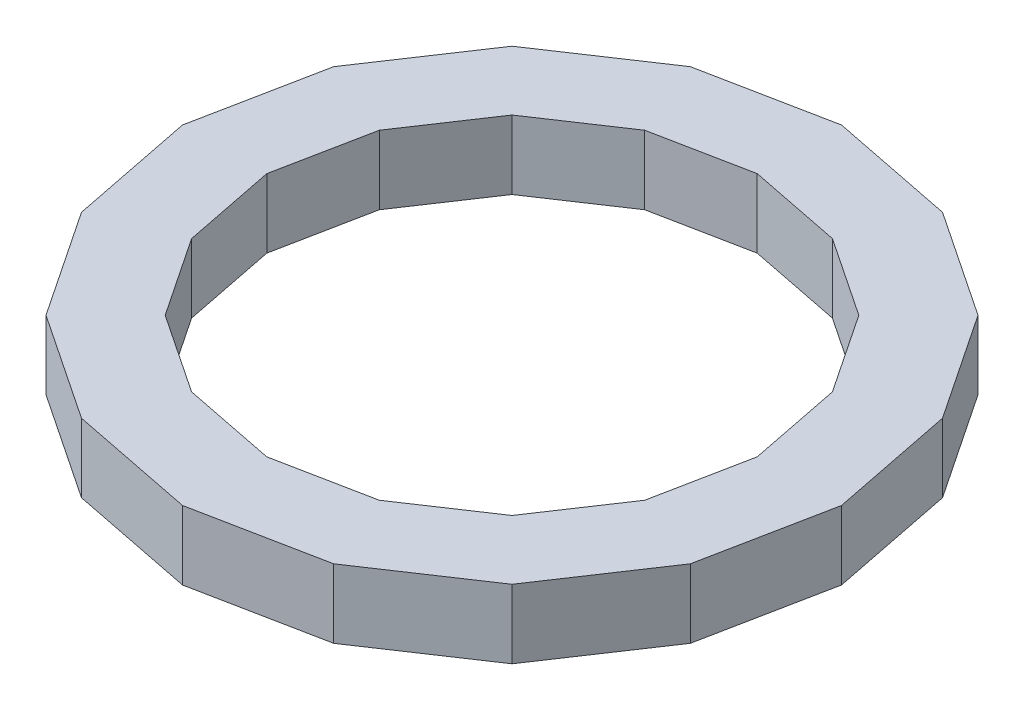
ISO-10303-21;
HEADER;
FILE_DESCRIPTION(('STEP AP214'),'2;1');
FILE_NAME('part.step','',(''),(''),'','','');
FILE_SCHEMA(('AUTOMOTIVE_DESIGN { 1 0 10303 214 1 1 1 1 }'));
ENDSEC;
DATA;
#1=APPLICATION_CONTEXT('core data for automotive mechanical design processes');
#2=APPLICATION_PROTOCOL_DEFINITION('international standard','automotive_design',2000,#1);
#3=PRODUCT_CONTEXT('',#1,'mechanical');
#4=PRODUCT('Part','Part','',(#3));
#5=PRODUCT_RELATED_PRODUCT_CATEGORY('part','',(#4));
#6=PRODUCT_DEFINITION_FORMATION('','',#4);
#7=PRODUCT_DEFINITION_CONTEXT('part definition',#1,'design');
#8=PRODUCT_DEFINITION('design','',#6,#7);
#9=PRODUCT_DEFINITION_SHAPE('','',#8);
#10=(LENGTH_UNIT() NAMED_UNIT(*) SI_UNIT(.MILLI.,.METRE.));
#11=(NAMED_UNIT(*) PLANE_ANGLE_UNIT() SI_UNIT($,.RADIAN.));
#12=(NAMED_UNIT(*) SI_UNIT($,.STERADIAN.) SOLID_ANGLE_UNIT());
#13=UNCERTAINTY_MEASURE_WITH_UNIT(LENGTH_MEASURE(1.E-05),#10,'distance_accuracy_value','');
#14=(GEOMETRIC_REPRESENTATION_CONTEXT(3) GLOBAL_UNCERTAINTY_ASSIGNED_CONTEXT((#13)) GLOBAL_UNIT_ASSIGNED_CONTEXT((#10,
#11,#12)) REPRESENTATION_CONTEXT('',''));
#15=CARTESIAN_POINT('',(0.,0.,0.));
#16=DIRECTION('',(0.,0.,1.));
#17=DIRECTION('',(1.,0.,0.));
#18=AXIS2_PLACEMENT_3D('',#15,#16,#17);
#19=CARTESIAN_POINT('',(0.,19.05,0.));
#20=DIRECTION('',(0.,1.,0.));
#21=DIRECTION('',(0.,0.,1.));
#22=AXIS2_PLACEMENT_3D('',#19,#20,#21);
#23=PLANE('',#22);
#24=DIRECTION('',(0.195090322016117,0.,-0.980785280403233));
#25=VECTOR('',#24,1.);
#26=CARTESIAN_POINT('',(84.1998614707948,19.05,34.8767245711379));
#27=LINE('',#26,#25);
#28=CARTESIAN_POINT('',(84.1998614707948,19.05,34.8767245711379));
#29=VERTEX_POINT('',#28);
#30=CARTESIAN_POINT('',(91.1372733216879,19.05,-1.00961399385723E-12));
#31=VERTEX_POINT('',#30);
#32=EDGE_CURVE('E379',#29,#31,#27,.T.);
#33=ORIENTED_EDGE('',*,*,#32,.T.);
#34=DIRECTION('',(-0.195090322016139,0.,-0.980785280403228));
#35=VECTOR('',#34,1.);
#36=CARTESIAN_POINT('',(91.1372733216879,19.05,-1.00961399385723E-12));
#37=LINE('',#36,#35);
#38=CARTESIAN_POINT('',(84.199861470794,19.05,-34.8767245711398));
#39=VERTEX_POINT('',#38);
#40=EDGE_CURVE('E383',#31,#39,#37,.T.);
#41=ORIENTED_EDGE('',*,*,#40,.T.);
#42=DIRECTION('',(-0.555570233019612,0.,-0.831469612302539));
#43=VECTOR('',#42,1.);
#44=CARTESIAN_POINT('',(84.199861470794,19.05,-34.8767245711398));
#45=LINE('',#44,#43);
#46=CARTESIAN_POINT('',(64.4437839846166,19.05,-64.4437839846181));
#47=VERTEX_POINT('',#46);
#48=EDGE_CURVE('E387',#39,#47,#45,.T.);
#49=ORIENTED_EDGE('',*,*,#48,.T.);
#50=DIRECTION('',(-0.831469612302552,0.,-0.555570233019592));
#51=VECTOR('',#50,1.);
#52=CARTESIAN_POINT('',(64.4437839846166,19.05,-64.4437839846181));
#53=LINE('',#52,#51);
#54=CARTESIAN_POINT('',(34.8767245711379,19.05,-84.1998614707948));
#55=VERTEX_POINT('',#54);
#56=EDGE_CURVE('E390',#47,#55,#53,.T.);
#57=ORIENTED_EDGE('',*,*,#56,.T.);
#58=DIRECTION('',(-0.980785280403233,0.,-0.195090322016117));
#59=VECTOR('',#58,1.);
#60=CARTESIAN_POINT('',(34.8767245711379,19.05,-84.1998614707948));
#61=LINE('',#60,#59);
#62=CARTESIAN_POINT('',(-1.10401997551013E-12,19.05,-91.1372733216879));
#63=VERTEX_POINT('',#62);
#64=EDGE_CURVE('E392',#55,#63,#61,.T.);
#65=ORIENTED_EDGE('',*,*,#64,.T.);
#66=DIRECTION('',(-0.980785280403228,0.,0.195090322016139));
#67=VECTOR('',#66,1.);
#68=CARTESIAN_POINT('',(-1.10401997551013E-12,19.05,-91.1372733216879));
#69=LINE('',#68,#67);
#70=CARTESIAN_POINT('',(-34.8767245711399,19.05,-84.199861470794));
#71=VERTEX_POINT('',#70);
#72=EDGE_CURVE('E395',#63,#71,#69,.T.);
#73=ORIENTED_EDGE('',*,*,#72,.T.);
#74=DIRECTION('',(-0.831469612302539,0.,0.555570233019612));
#75=VECTOR('',#74,1.);
#76=CARTESIAN_POINT('',(-34.8767245711399,19.05,-84.199861470794));
#77=LINE('',#76,#75);
#78=CARTESIAN_POINT('',(-64.4437839846181,19.05,-64.4437839846166));
#79=VERTEX_POINT('',#78);
#80=EDGE_CURVE('E397',#71,#79,#77,.T.);
#81=ORIENTED_EDGE('',*,*,#80,.T.);
#82=DIRECTION('',(-0.555570233019593,0.,0.831469612302552));
#83=VECTOR('',#82,1.);
#84=CARTESIAN_POINT('',(-64.4437839846181,19.05,-64.4437839846166));
#85=LINE('',#84,#83);
#86=CARTESIAN_POINT('',(-84.1998614707948,19.05,-34.8767245711379));
#87=VERTEX_POINT('',#86);
#88=EDGE_CURVE('E399',#79,#87,#85,.T.);
#89=ORIENTED_EDGE('',*,*,#88,.T.);
#90=DIRECTION('',(-0.195090322016117,0.,0.980785280403233));
#91=VECTOR('',#90,1.);
#92=CARTESIAN_POINT('',(-84.1998614707948,19.05,-34.8767245711379));
#93=LINE('',#92,#91);
#94=CARTESIAN_POINT('',(-91.1372733216879,19.05,1.03951490206439E-12));
#95=VERTEX_POINT('',#94);
#96=EDGE_CURVE('E401',#87,#95,#93,.T.);
#97=ORIENTED_EDGE('',*,*,#96,.T.);
#98=DIRECTION('',(0.195090322016139,0.,0.980785280403228));
#99=VECTOR('',#98,1.);
#100=CARTESIAN_POINT('',(-91.1372733216879,19.05,1.03951490206439E-12));
#101=LINE('',#100,#99);
#102=CARTESIAN_POINT('',(-84.199861470794,19.05,34.8767245711399));
#103=VERTEX_POINT('',#102);
#104=EDGE_CURVE('E403',#95,#103,#101,.T.);
#105=ORIENTED_EDGE('',*,*,#104,.T.);
#106=DIRECTION('',(0.555570233019612,0.,0.831469612302539));
#107=VECTOR('',#106,1.);
#108=CARTESIAN_POINT('',(-84.199861470794,19.05,34.8767245711399));
#109=LINE('',#108,#107);
#110=CARTESIAN_POINT('',(-64.4437839846166,19.05,64.4437839846181));
#111=VERTEX_POINT('',#110);
#112=EDGE_CURVE('E405',#103,#111,#109,.T.);
#113=ORIENTED_EDGE('',*,*,#112,.T.);
#114=DIRECTION('',(0.831469612302552,0.,0.555570233019593));
#115=VECTOR('',#114,1.);
#116=CARTESIAN_POINT('',(-64.4437839846166,19.05,64.4437839846181));
#117=LINE('',#116,#115);
#118=CARTESIAN_POINT('',(-34.8767245711379,19.05,84.1998614707948));
#119=VERTEX_POINT('',#118);
#120=EDGE_CURVE('E407',#111,#119,#117,.T.);
#121=ORIENTED_EDGE('',*,*,#120,.T.);
#122=DIRECTION('',(0.980785280403233,0.,0.195090322016117));
#123=VECTOR('',#122,1.);
#124=CARTESIAN_POINT('',(-34.8767245711379,19.05,84.1998614707948));
#125=LINE('',#124,#123);
#126=CARTESIAN_POINT('',(1.00032528467443E-12,19.05,91.137273321688));
#127=VERTEX_POINT('',#126);
#128=EDGE_CURVE('E410',#119,#127,#125,.T.);
#129=ORIENTED_EDGE('',*,*,#128,.T.);
#130=DIRECTION('',(0.980785280403228,0.,-0.195090322016139));
#131=VECTOR('',#130,1.);
#132=CARTESIAN_POINT('',(1.00032528467443E-12,19.05,91.137273321688));
#133=LINE('',#132,#131);
#134=CARTESIAN_POINT('',(34.8767245711398,19.05,84.199861470794));
#135=VERTEX_POINT('',#134);
#136=EDGE_CURVE('E412',#127,#135,#133,.T.);
#137=ORIENTED_EDGE('',*,*,#136,.T.);
#138=DIRECTION('',(0.831469612302539,0.,-0.555570233019611));
#139=VECTOR('',#138,1.);
#140=CARTESIAN_POINT('',(34.8767245711398,19.05,84.199861470794));
#141=LINE('',#140,#139);
#142=CARTESIAN_POINT('',(64.4437839846181,19.05,64.4437839846166));
#143=VERTEX_POINT('',#142);
#144=EDGE_CURVE('E414',#135,#143,#141,.T.);
#145=ORIENTED_EDGE('',*,*,#144,.T.);
#146=DIRECTION('',(0.555570233019593,0.,-0.831469612302552));
#147=VECTOR('',#146,1.);
#148=CARTESIAN_POINT('',(64.4437839846181,19.05,64.4437839846166));
#149=LINE('',#148,#147);
#150=EDGE_CURVE('E416',#143,#29,#149,.T.);
#151=ORIENTED_EDGE('',*,*,#150,.T.);
#152=EDGE_LOOP('',(#33,#41,#49,#57,#65,#73,#81,#89,#97,#105,#113,#121,#129,#137,#145,#151));
#153=FACE_BOUND('',#152,.T.);
#154=DIRECTION('',(-0.19509032201614,0.,-0.980785280403228));
#155=VECTOR('',#154,1.);
#156=CARTESIAN_POINT('',(67.8294194450458,19.05,-7.41912001768866E-13));
#157=LINE('',#156,#155);
#158=CARTESIAN_POINT('',(67.8294194450458,19.05,-7.41912001768866E-13));
#159=VERTEX_POINT('',#158);
#160=CARTESIAN_POINT('',(62.6662123274006,19.05,-25.9571950485622));
#161=VERTEX_POINT('',#160);
#162=EDGE_CURVE('E252',#159,#161,#157,.T.);
#163=ORIENTED_EDGE('',*,*,#162,.F.);
#164=DIRECTION('',(0.195090322016117,0.,-0.980785280403233));
#165=VECTOR('',#164,1.);
#166=CARTESIAN_POINT('',(62.6662123274012,19.05,25.9571950485608));
#167=LINE('',#166,#165);
#168=CARTESIAN_POINT('',(62.6662123274012,19.05,25.9571950485608));
#169=VERTEX_POINT('',#168);
#170=EDGE_CURVE('E243',#169,#159,#167,.T.);
#171=ORIENTED_EDGE('',*,*,#170,.F.);
#172=DIRECTION('',(0.555570233019593,0.,-0.831469612302552));
#173=VECTOR('',#172,1.);
#174=CARTESIAN_POINT('',(47.9626424535391,19.05,47.962642453538));
#175=LINE('',#174,#173);
#176=CARTESIAN_POINT('',(47.9626424535391,19.05,47.962642453538));
#177=VERTEX_POINT('',#176);
#178=EDGE_CURVE('E302',#177,#169,#175,.T.);
#179=ORIENTED_EDGE('',*,*,#178,.F.);
#180=DIRECTION('',(0.831469612302539,0.,-0.555570233019612));
#181=VECTOR('',#180,1.);
#182=CARTESIAN_POINT('',(25.9571950485622,19.05,62.6662123274006));
#183=LINE('',#182,#181);
#184=CARTESIAN_POINT('',(25.9571950485622,19.05,62.6662123274006));
#185=VERTEX_POINT('',#184);
#186=EDGE_CURVE('E300',#185,#177,#183,.T.);
#187=ORIENTED_EDGE('',*,*,#186,.F.);
#188=DIRECTION('',(0.980785280403228,0.,-0.195090322016139));
#189=VECTOR('',#188,1.);
#190=CARTESIAN_POINT('',(8.17724973134349E-13,19.05,67.8294194450458));
#191=LINE('',#190,#189);
#192=CARTESIAN_POINT('',(8.17724973134349E-13,19.05,67.8294194450458));
#193=VERTEX_POINT('',#192);
#194=EDGE_CURVE('E298',#193,#185,#191,.T.);
#195=ORIENTED_EDGE('',*,*,#194,.F.);
#196=DIRECTION('',(0.980785280403233,0.,0.195090322016117));
#197=VECTOR('',#196,1.);
#198=CARTESIAN_POINT('',(-25.9571950485608,19.05,62.6662123274012));
#199=LINE('',#198,#197);
#200=CARTESIAN_POINT('',(-25.9571950485608,19.05,62.6662123274012));
#201=VERTEX_POINT('',#200);
#202=EDGE_CURVE('E296',#201,#193,#199,.T.);
#203=ORIENTED_EDGE('',*,*,#202,.F.);
#204=DIRECTION('',(0.831469612302552,0.,0.555570233019593));
#205=VECTOR('',#204,1.);
#206=CARTESIAN_POINT('',(-47.962642453538,19.05,47.9626424535391));
#207=LINE('',#206,#205);
#208=CARTESIAN_POINT('',(-47.962642453538,19.05,47.9626424535391));
#209=VERTEX_POINT('',#208);
#210=EDGE_CURVE('E294',#209,#201,#207,.T.);
#211=ORIENTED_EDGE('',*,*,#210,.F.);
#212=DIRECTION('',(0.555570233019612,0.,0.831469612302539));
#213=VECTOR('',#212,1.);
#214=CARTESIAN_POINT('',(-62.6662123274006,19.05,25.9571950485623));
#215=LINE('',#214,#213);
#216=CARTESIAN_POINT('',(-62.6662123274006,19.05,25.9571950485623));
#217=VERTEX_POINT('',#216);
#218=EDGE_CURVE('E291',#217,#209,#215,.T.);
#219=ORIENTED_EDGE('',*,*,#218,.F.);
#220=DIRECTION('',(0.19509032201614,0.,0.980785280403228));
#221=VECTOR('',#220,1.);
#222=CARTESIAN_POINT('',(-67.8294194450458,19.05,7.76293029344912E-13));
#223=LINE('',#222,#221);
#224=CARTESIAN_POINT('',(-67.8294194450458,19.05,7.76293029344912E-13));
#225=VERTEX_POINT('',#224);
#226=EDGE_CURVE('E289',#225,#217,#223,.T.);
#227=ORIENTED_EDGE('',*,*,#226,.F.);
#228=DIRECTION('',(-0.195090322016117,0.,0.980785280403233));
#229=VECTOR('',#228,1.);
#230=CARTESIAN_POINT('',(-62.6662123274012,19.05,-25.9571950485608));
#231=LINE('',#230,#229);
#232=CARTESIAN_POINT('',(-62.6662123274012,19.05,-25.9571950485608));
#233=VERTEX_POINT('',#232);
#234=EDGE_CURVE('E286',#233,#225,#231,.T.);
#235=ORIENTED_EDGE('',*,*,#234,.F.);
#236=DIRECTION('',(-0.555570233019592,0.,0.831469612302552));
#237=VECTOR('',#236,1.);
#238=CARTESIAN_POINT('',(-47.9626424535391,19.05,-47.962642453538));
#239=LINE('',#238,#237);
#240=CARTESIAN_POINT('',(-47.9626424535391,19.05,-47.962642453538));
#241=VERTEX_POINT('',#240);
#242=EDGE_CURVE('E284',#241,#233,#239,.T.);
#243=ORIENTED_EDGE('',*,*,#242,.F.);
#244=DIRECTION('',(-0.831469612302539,0.,0.555570233019612));
#245=VECTOR('',#244,1.);
#246=CARTESIAN_POINT('',(-25.9571950485623,19.05,-62.6662123274006));
#247=LINE('',#246,#245);
#248=CARTESIAN_POINT('',(-25.9571950485623,19.05,-62.6662123274006));
#249=VERTEX_POINT('',#248);
#250=EDGE_CURVE('E281',#249,#241,#247,.T.);
#251=ORIENTED_EDGE('',*,*,#250,.F.);
#252=DIRECTION('',(-0.980785280403228,0.,0.19509032201614));
#253=VECTOR('',#252,1.);
#254=CARTESIAN_POINT('',(-7.98168190524189E-13,19.05,-67.8294194450458));
#255=LINE('',#254,#253);
#256=CARTESIAN_POINT('',(-7.98168190524189E-13,19.05,-67.8294194450458));
#257=VERTEX_POINT('',#256);
#258=EDGE_CURVE('E279',#257,#249,#255,.T.);
#259=ORIENTED_EDGE('',*,*,#258,.F.);
#260=DIRECTION('',(-0.980785280403233,0.,-0.195090322016117));
#261=VECTOR('',#260,1.);
#262=CARTESIAN_POINT('',(25.9571950485607,19.05,-62.6662123274012));
#263=LINE('',#262,#261);
#264=CARTESIAN_POINT('',(25.9571950485607,19.05,-62.6662123274012));
#265=VERTEX_POINT('',#264);
#266=EDGE_CURVE('E277',#265,#257,#263,.T.);
#267=ORIENTED_EDGE('',*,*,#266,.F.);
#268=DIRECTION('',(-0.831469612302552,0.,-0.555570233019593));
#269=VECTOR('',#268,1.);
#270=CARTESIAN_POINT('',(47.962642453538,19.05,-47.9626424535391));
#271=LINE('',#270,#269);
#272=CARTESIAN_POINT('',(47.962642453538,19.05,-47.9626424535391));
#273=VERTEX_POINT('',#272);
#274=EDGE_CURVE('E272',#273,#265,#271,.T.);
#275=ORIENTED_EDGE('',*,*,#274,.F.);
#276=DIRECTION('',(-0.555570233019612,0.,-0.831469612302539));
#277=VECTOR('',#276,1.);
#278=CARTESIAN_POINT('',(62.6662123274006,19.05,-25.9571950485622));
#279=LINE('',#278,#277);
#280=EDGE_CURVE('E265',#161,#273,#279,.T.);
#281=ORIENTED_EDGE('',*,*,#280,.F.);
#282=EDGE_LOOP('',(#163,#171,#179,#187,#195,#203,#211,#219,#227,#235,#243,#251,#259,#267,#275,#281));
#283=FACE_BOUND('',#282,.T.);
#284=ADVANCED_FACE('F34',(#153,#283),#23,.T.);
#285=CARTESIAN_POINT('',(0.,0.,0.));
#286=DIRECTION('',(0.,1.,0.));
#287=DIRECTION('',(0.,0.,1.));
#288=AXIS2_PLACEMENT_3D('',#285,#286,#287);
#289=PLANE('',#288);
#290=DIRECTION('',(0.195090322016117,0.,-0.980785280403233));
#291=VECTOR('',#290,1.);
#292=CARTESIAN_POINT('',(84.1998614707948,0.,34.8767245711379));
#293=LINE('',#292,#291);
#294=CARTESIAN_POINT('',(84.1998614707948,0.,34.8767245711379));
#295=VERTEX_POINT('',#294);
#296=CARTESIAN_POINT('',(91.1372733216879,0.,-1.00961399385723E-12));
#297=VERTEX_POINT('',#296);
#298=EDGE_CURVE('E260',#295,#297,#293,.T.);
#299=ORIENTED_EDGE('',*,*,#298,.F.);
#300=DIRECTION('',(0.555570233019593,0.,-0.831469612302552));
#301=VECTOR('',#300,1.);
#302=CARTESIAN_POINT('',(64.4437839846181,0.,64.4437839846166));
#303=LINE('',#302,#301);
#304=CARTESIAN_POINT('',(64.4437839846181,0.,64.4437839846166));
#305=VERTEX_POINT('',#304);
#306=EDGE_CURVE('E384',#305,#295,#303,.T.);
#307=ORIENTED_EDGE('',*,*,#306,.F.);
#308=DIRECTION('',(0.831469612302539,0.,-0.555570233019611));
#309=VECTOR('',#308,1.);
#310=CARTESIAN_POINT('',(34.8767245711398,0.,84.199861470794));
#311=LINE('',#310,#309);
#312=CARTESIAN_POINT('',(34.8767245711398,0.,84.199861470794));
#313=VERTEX_POINT('',#312);
#314=EDGE_CURVE('E450',#313,#305,#311,.T.);
#315=ORIENTED_EDGE('',*,*,#314,.F.);
#316=DIRECTION('',(0.980785280403228,0.,-0.195090322016139));
#317=VECTOR('',#316,1.);
#318=CARTESIAN_POINT('',(1.00032528467443E-12,0.,91.137273321688));
#319=LINE('',#318,#317);
#320=CARTESIAN_POINT('',(1.00032528467443E-12,0.,91.137273321688));
#321=VERTEX_POINT('',#320);
#322=EDGE_CURVE('E448',#321,#313,#319,.T.);
#323=ORIENTED_EDGE('',*,*,#322,.F.);
#324=DIRECTION('',(0.980785280403233,0.,0.195090322016117));
#325=VECTOR('',#324,1.);
#326=CARTESIAN_POINT('',(-34.8767245711379,0.,84.1998614707948));
#327=LINE('',#326,#325);
#328=CARTESIAN_POINT('',(-34.8767245711379,0.,84.1998614707948));
#329=VERTEX_POINT('',#328);
#330=EDGE_CURVE('E445',#329,#321,#327,.T.);
#331=ORIENTED_EDGE('',*,*,#330,.F.);
#332=DIRECTION('',(0.831469612302552,0.,0.555570233019593));
#333=VECTOR('',#332,1.);
#334=CARTESIAN_POINT('',(-64.4437839846166,0.,64.4437839846181));
#335=LINE('',#334,#333);
#336=CARTESIAN_POINT('',(-64.4437839846166,0.,64.4437839846181));
#337=VERTEX_POINT('',#336);
#338=EDGE_CURVE('E443',#337,#329,#335,.T.);
#339=ORIENTED_EDGE('',*,*,#338,.F.);
#340=DIRECTION('',(0.555570233019612,0.,0.831469612302539));
#341=VECTOR('',#340,1.);
#342=CARTESIAN_POINT('',(-84.199861470794,0.,34.8767245711399));
#343=LINE('',#342,#341);
#344=CARTESIAN_POINT('',(-84.199861470794,0.,34.8767245711399));
#345=VERTEX_POINT('',#344);
#346=EDGE_CURVE('E441',#345,#337,#343,.T.);
#347=ORIENTED_EDGE('',*,*,#346,.F.);
#348=DIRECTION('',(0.195090322016139,0.,0.980785280403228));
#349=VECTOR('',#348,1.);
#350=CARTESIAN_POINT('',(-91.1372733216879,0.,1.03951490206439E-12));
#351=LINE('',#350,#349);
#352=CARTESIAN_POINT('',(-91.1372733216879,0.,1.03951490206439E-12));
#353=VERTEX_POINT('',#352);
#354=EDGE_CURVE('E439',#353,#345,#351,.T.);
#355=ORIENTED_EDGE('',*,*,#354,.F.);
#356=DIRECTION('',(-0.195090322016117,0.,0.980785280403233));
#357=VECTOR('',#356,1.);
#358=CARTESIAN_POINT('',(-84.1998614707948,0.,-34.8767245711379));
#359=LINE('',#358,#357);
#360=CARTESIAN_POINT('',(-84.1998614707948,0.,-34.8767245711379));
#361=VERTEX_POINT('',#360);
#362=EDGE_CURVE('E437',#361,#353,#359,.T.);
#363=ORIENTED_EDGE('',*,*,#362,.F.);
#364=DIRECTION('',(-0.555570233019593,0.,0.831469612302552));
#365=VECTOR('',#364,1.);
#366=CARTESIAN_POINT('',(-64.4437839846181,0.,-64.4437839846166));
#367=LINE('',#366,#365);
#368=CARTESIAN_POINT('',(-64.4437839846181,0.,-64.4437839846166));
#369=VERTEX_POINT('',#368);
#370=EDGE_CURVE('E435',#369,#361,#367,.T.);
#371=ORIENTED_EDGE('',*,*,#370,.F.);
#372=DIRECTION('',(-0.831469612302539,0.,0.555570233019612));
#373=VECTOR('',#372,1.);
#374=CARTESIAN_POINT('',(-34.8767245711399,0.,-84.199861470794));
#375=LINE('',#374,#373);
#376=CARTESIAN_POINT('',(-34.8767245711399,0.,-84.199861470794));
#377=VERTEX_POINT('',#376);
#378=EDGE_CURVE('E433',#377,#369,#375,.T.);
#379=ORIENTED_EDGE('',*,*,#378,.F.);
#380=DIRECTION('',(-0.980785280403228,0.,0.195090322016139));
#381=VECTOR('',#380,1.);
#382=CARTESIAN_POINT('',(-1.10401997551013E-12,0.,-91.1372733216879));
#383=LINE('',#382,#381);
#384=CARTESIAN_POINT('',(-1.10401997551013E-12,0.,-91.1372733216879));
#385=VERTEX_POINT('',#384);
#386=EDGE_CURVE('E431',#385,#377,#383,.T.);
#387=ORIENTED_EDGE('',*,*,#386,.F.);
#388=DIRECTION('',(-0.980785280403233,0.,-0.195090322016117));
#389=VECTOR('',#388,1.);
#390=CARTESIAN_POINT('',(34.8767245711379,0.,-84.1998614707948));
#391=LINE('',#390,#389);
#392=CARTESIAN_POINT('',(34.8767245711379,0.,-84.1998614707948));
#393=VERTEX_POINT('',#392);
#394=EDGE_CURVE('E429',#393,#385,#391,.T.);
#395=ORIENTED_EDGE('',*,*,#394,.F.);
#396=DIRECTION('',(-0.831469612302552,0.,-0.555570233019592));
#397=VECTOR('',#396,1.);
#398=CARTESIAN_POINT('',(64.4437839846166,0.,-64.4437839846181));
#399=LINE('',#398,#397);
#400=CARTESIAN_POINT('',(64.4437839846166,0.,-64.4437839846181));
#401=VERTEX_POINT('',#400);
#402=EDGE_CURVE('E427',#401,#393,#399,.T.);
#403=ORIENTED_EDGE('',*,*,#402,.F.);
#404=DIRECTION('',(-0.555570233019612,0.,-0.831469612302539));
#405=VECTOR('',#404,1.);
#406=CARTESIAN_POINT('',(84.199861470794,0.,-34.8767245711398));
#407=LINE('',#406,#405);
#408=CARTESIAN_POINT('',(84.199861470794,0.,-34.8767245711398));
#409=VERTEX_POINT('',#408);
#410=EDGE_CURVE('E424',#409,#401,#407,.T.);
#411=ORIENTED_EDGE('',*,*,#410,.F.);
#412=DIRECTION('',(-0.195090322016139,0.,-0.980785280403228));
#413=VECTOR('',#412,1.);
#414=CARTESIAN_POINT('',(91.1372733216879,0.,-1.00961399385723E-12));
#415=LINE('',#414,#413);
#416=EDGE_CURVE('E421',#297,#409,#415,.T.);
#417=ORIENTED_EDGE('',*,*,#416,.F.);
#418=EDGE_LOOP('',(#299,#307,#315,#323,#331,#339,#347,#355,#363,#371,#379,#387,#395,#403,#411,#417));
#419=FACE_BOUND('',#418,.T.);
#420=DIRECTION('',(0.195090322016117,0.,-0.980785280403233));
#421=VECTOR('',#420,1.);
#422=CARTESIAN_POINT('',(62.6662123274012,0.,25.9571950485608));
#423=LINE('',#422,#421);
#424=CARTESIAN_POINT('',(62.6662123274012,0.,25.9571950485608));
#425=VERTEX_POINT('',#424);
#426=CARTESIAN_POINT('',(67.8294194450458,0.,-7.41912001768866E-13));
#427=VERTEX_POINT('',#426);
#428=EDGE_CURVE('E57',#425,#427,#423,.T.);
#429=ORIENTED_EDGE('',*,*,#428,.T.);
#430=DIRECTION('',(-0.19509032201614,0.,-0.980785280403228));
#431=VECTOR('',#430,1.);
#432=CARTESIAN_POINT('',(67.8294194450458,0.,-7.41912001768866E-13));
#433=LINE('',#432,#431);
#434=CARTESIAN_POINT('',(62.6662123274006,0.,-25.9571950485622));
#435=VERTEX_POINT('',#434);
#436=EDGE_CURVE('E259',#427,#435,#433,.T.);
#437=ORIENTED_EDGE('',*,*,#436,.T.);
#438=DIRECTION('',(-0.555570233019612,0.,-0.831469612302539));
#439=VECTOR('',#438,1.);
#440=CARTESIAN_POINT('',(62.6662123274006,0.,-25.9571950485622));
#441=LINE('',#440,#439);
#442=CARTESIAN_POINT('',(47.962642453538,0.,-47.9626424535391));
#443=VERTEX_POINT('',#442);
#444=EDGE_CURVE('E308',#435,#443,#441,.T.);
#445=ORIENTED_EDGE('',*,*,#444,.T.);
#446=DIRECTION('',(-0.831469612302552,0.,-0.555570233019593));
#447=VECTOR('',#446,1.);
#448=CARTESIAN_POINT('',(47.962642453538,0.,-47.9626424535391));
#449=LINE('',#448,#447);
#450=CARTESIAN_POINT('',(25.9571950485607,0.,-62.6662123274012));
#451=VERTEX_POINT('',#450);
#452=EDGE_CURVE('E311',#443,#451,#449,.T.);
#453=ORIENTED_EDGE('',*,*,#452,.T.);
#454=DIRECTION('',(-0.980785280403233,0.,-0.195090322016117));
#455=VECTOR('',#454,1.);
#456=CARTESIAN_POINT('',(25.9571950485607,0.,-62.6662123274012));
#457=LINE('',#456,#455);
#458=CARTESIAN_POINT('',(-7.98168190524189E-13,0.,-67.8294194450458));
#459=VERTEX_POINT('',#458);
#460=EDGE_CURVE('E314',#451,#459,#457,.T.);
#461=ORIENTED_EDGE('',*,*,#460,.T.);
#462=DIRECTION('',(-0.980785280403228,0.,0.19509032201614));
#463=VECTOR('',#462,1.);
#464=CARTESIAN_POINT('',(-7.98168190524189E-13,0.,-67.8294194450458));
#465=LINE('',#464,#463);
#466=CARTESIAN_POINT('',(-25.9571950485623,0.,-62.6662123274006));
#467=VERTEX_POINT('',#466);
#468=EDGE_CURVE('E318',#459,#467,#465,.T.);
#469=ORIENTED_EDGE('',*,*,#468,.T.);
#470=DIRECTION('',(-0.831469612302539,0.,0.555570233019612));
#471=VECTOR('',#470,1.);
#472=CARTESIAN_POINT('',(-25.9571950485623,0.,-62.6662123274006));
#473=LINE('',#472,#471);
#474=CARTESIAN_POINT('',(-47.9626424535391,0.,-47.962642453538));
#475=VERTEX_POINT('',#474);
#476=EDGE_CURVE('E322',#467,#475,#473,.T.);
#477=ORIENTED_EDGE('',*,*,#476,.T.);
#478=DIRECTION('',(-0.555570233019592,0.,0.831469612302552));
#479=VECTOR('',#478,1.);
#480=CARTESIAN_POINT('',(-47.9626424535391,0.,-47.962642453538));
#481=LINE('',#480,#479);
#482=CARTESIAN_POINT('',(-62.6662123274012,0.,-25.9571950485608));
#483=VERTEX_POINT('',#482);
#484=EDGE_CURVE('E326',#475,#483,#481,.T.);
#485=ORIENTED_EDGE('',*,*,#484,.T.);
#486=DIRECTION('',(-0.195090322016117,0.,0.980785280403233));
#487=VECTOR('',#486,1.);
#488=CARTESIAN_POINT('',(-62.6662123274012,0.,-25.9571950485608));
#489=LINE('',#488,#487);
#490=CARTESIAN_POINT('',(-67.8294194450458,0.,7.76293029344912E-13));
#491=VERTEX_POINT('',#490);
#492=EDGE_CURVE('E329',#483,#491,#489,.T.);
#493=ORIENTED_EDGE('',*,*,#492,.T.);
#494=DIRECTION('',(0.19509032201614,0.,0.980785280403228));
#495=VECTOR('',#494,1.);
#496=CARTESIAN_POINT('',(-67.8294194450458,0.,7.76293029344912E-13));
#497=LINE('',#496,#495);
#498=CARTESIAN_POINT('',(-62.6662123274006,0.,25.9571950485623));
#499=VERTEX_POINT('',#498);
#500=EDGE_CURVE('E332',#491,#499,#497,.T.);
#501=ORIENTED_EDGE('',*,*,#500,.T.);
#502=DIRECTION('',(0.555570233019612,0.,0.831469612302539));
#503=VECTOR('',#502,1.);
#504=CARTESIAN_POINT('',(-62.6662123274006,0.,25.9571950485623));
#505=LINE('',#504,#503);
#506=CARTESIAN_POINT('',(-47.962642453538,0.,47.9626424535391));
#507=VERTEX_POINT('',#506);
#508=EDGE_CURVE('E335',#499,#507,#505,.T.);
#509=ORIENTED_EDGE('',*,*,#508,.T.);
#510=DIRECTION('',(0.831469612302552,0.,0.555570233019593));
#511=VECTOR('',#510,1.);
#512=CARTESIAN_POINT('',(-47.962642453538,0.,47.9626424535391));
#513=LINE('',#512,#511);
#514=CARTESIAN_POINT('',(-25.9571950485608,0.,62.6662123274012));
#515=VERTEX_POINT('',#514);
#516=EDGE_CURVE('E338',#507,#515,#513,.T.);
#517=ORIENTED_EDGE('',*,*,#516,.T.);
#518=DIRECTION('',(0.980785280403233,0.,0.195090322016117));
#519=VECTOR('',#518,1.);
#520=CARTESIAN_POINT('',(-25.9571950485608,0.,62.6662123274012));
#521=LINE('',#520,#519);
#522=CARTESIAN_POINT('',(8.17724973134349E-13,0.,67.8294194450458));
#523=VERTEX_POINT('',#522);
#524=EDGE_CURVE('E341',#515,#523,#521,.T.);
#525=ORIENTED_EDGE('',*,*,#524,.T.);
#526=DIRECTION('',(0.980785280403228,0.,-0.195090322016139));
#527=VECTOR('',#526,1.);
#528=CARTESIAN_POINT('',(8.17724973134349E-13,0.,67.8294194450458));
#529=LINE('',#528,#527);
#530=CARTESIAN_POINT('',(25.9571950485622,0.,62.6662123274006));
#531=VERTEX_POINT('',#530);
#532=EDGE_CURVE('E344',#523,#531,#529,.T.);
#533=ORIENTED_EDGE('',*,*,#532,.T.);
#534=DIRECTION('',(0.831469612302539,0.,-0.555570233019612));
#535=VECTOR('',#534,1.);
#536=CARTESIAN_POINT('',(25.9571950485622,0.,62.6662123274006));
#537=LINE('',#536,#535);
#538=CARTESIAN_POINT('',(47.9626424535391,0.,47.962642453538));
#539=VERTEX_POINT('',#538);
#540=EDGE_CURVE('E347',#531,#539,#537,.T.);
#541=ORIENTED_EDGE('',*,*,#540,.T.);
#542=DIRECTION('',(0.555570233019593,0.,-0.831469612302552));
#543=VECTOR('',#542,1.);
#544=CARTESIAN_POINT('',(47.9626424535391,0.,47.962642453538));
#545=LINE('',#544,#543);
#546=EDGE_CURVE('E253',#539,#425,#545,.T.);
#547=ORIENTED_EDGE('',*,*,#546,.T.);
#548=EDGE_LOOP('',(#429,#437,#445,#453,#461,#469,#477,#485,#493,#501,#509,#517,#525,#533,#541,#547));
#549=FACE_BOUND('',#548,.T.);
#550=ADVANCED_FACE('F510',(#419,#549),#289,.F.);
#551=CARTESIAN_POINT('',(84.1998614707948,19.05,34.8767245711379));
#552=DIRECTION('',(-0.980785280403233,0.,-0.195090322016117));
#553=DIRECTION('',(-0.195090322016118,0.,0.980785280403233));
#554=AXIS2_PLACEMENT_3D('',#551,#552,#553);
#555=PLANE('',#554);
#556=ORIENTED_EDGE('',*,*,#298,.T.);
#557=DIRECTION('',(0.,-1.,0.));
#558=VECTOR('',#557,1.);
#559=CARTESIAN_POINT('',(91.1372733216879,19.05,-1.00961399385723E-12));
#560=LINE('',#559,#558);
#561=EDGE_CURVE('E11',#31,#297,#560,.T.);
#562=ORIENTED_EDGE('',*,*,#561,.F.);
#563=ORIENTED_EDGE('',*,*,#32,.F.);
#564=DIRECTION('',(0.,-1.,0.));
#565=VECTOR('',#564,1.);
#566=CARTESIAN_POINT('',(84.1998614707948,19.05,34.8767245711379));
#567=LINE('',#566,#565);
#568=EDGE_CURVE('E418',#29,#295,#567,.T.);
#569=ORIENTED_EDGE('',*,*,#568,.T.);
#570=EDGE_LOOP('',(#556,#562,#563,#569));
#571=FACE_BOUND('',#570,.T.);
#572=ADVANCED_FACE('F36',(#571),#555,.F.);
#573=CARTESIAN_POINT('',(91.1372733216879,19.05,-1.00961399385723E-12));
#574=DIRECTION('',(-0.980785280403228,0.,0.195090322016139));
#575=DIRECTION('',(0.195090322016139,0.,0.980785280403228));
#576=AXIS2_PLACEMENT_3D('',#573,#574,#575);
#577=PLANE('',#576);
#578=ORIENTED_EDGE('',*,*,#416,.T.);
#579=DIRECTION('',(0.,-1.,0.));
#580=VECTOR('',#579,1.);
#581=CARTESIAN_POINT('',(84.199861470794,19.05,-34.8767245711398));
#582=LINE('',#581,#580);
#583=EDGE_CURVE('E42',#39,#409,#582,.T.);
#584=ORIENTED_EDGE('',*,*,#583,.F.);
#585=ORIENTED_EDGE('',*,*,#40,.F.);
#586=ORIENTED_EDGE('',*,*,#561,.T.);
#587=EDGE_LOOP('',(#578,#584,#585,#586));
#588=FACE_BOUND('',#587,.T.);
#589=ADVANCED_FACE('F527',(#588),#577,.F.);
#590=CARTESIAN_POINT('',(84.199861470794,19.05,-34.8767245711398));
#591=DIRECTION('',(-0.831469612302539,0.,0.555570233019612));
#592=DIRECTION('',(0.555570233019612,0.,0.831469612302539));
#593=AXIS2_PLACEMENT_3D('',#590,#591,#592);
#594=PLANE('',#593);
#595=ORIENTED_EDGE('',*,*,#410,.T.);
#596=DIRECTION('',(0.,-1.,0.));
#597=VECTOR('',#596,1.);
#598=CARTESIAN_POINT('',(64.4437839846166,19.05,-64.4437839846181));
#599=LINE('',#598,#597);
#600=EDGE_CURVE('E495',#47,#401,#599,.T.);
#601=ORIENTED_EDGE('',*,*,#600,.F.);
#602=ORIENTED_EDGE('',*,*,#48,.F.);
#603=ORIENTED_EDGE('',*,*,#583,.T.);
#604=EDGE_LOOP('',(#595,#601,#602,#603));
#605=FACE_BOUND('',#604,.T.);
#606=ADVANCED_FACE('F504',(#605),#594,.F.);
#607=CARTESIAN_POINT('',(64.4437839846166,19.05,-64.4437839846181));
#608=DIRECTION('',(-0.555570233019592,0.,0.831469612302552));
#609=DIRECTION('',(0.831469612302552,0.,0.555570233019592));
#610=AXIS2_PLACEMENT_3D('',#607,#608,#609);
#611=PLANE('',#610);
#612=ORIENTED_EDGE('',*,*,#402,.T.);
#613=DIRECTION('',(0.,-1.,0.));
#614=VECTOR('',#613,1.);
#615=CARTESIAN_POINT('',(34.8767245711379,19.05,-84.1998614707948));
#616=LINE('',#615,#614);
#617=EDGE_CURVE('E492',#55,#393,#616,.T.);
#618=ORIENTED_EDGE('',*,*,#617,.F.);
#619=ORIENTED_EDGE('',*,*,#56,.F.);
#620=ORIENTED_EDGE('',*,*,#600,.T.);
#621=EDGE_LOOP('',(#612,#618,#619,#620));
#622=FACE_BOUND('',#621,.T.);
#623=ADVANCED_FACE('F516',(#622),#611,.F.);
#624=CARTESIAN_POINT('',(34.8767245711379,19.05,-84.1998614707948));
#625=DIRECTION('',(-0.195090322016117,0.,0.980785280403233));
#626=DIRECTION('',(0.980785280403233,0.,0.195090322016117));
#627=AXIS2_PLACEMENT_3D('',#624,#625,#626);
#628=PLANE('',#627);
#629=ORIENTED_EDGE('',*,*,#394,.T.);
#630=DIRECTION('',(0.,-1.,0.));
#631=VECTOR('',#630,1.);
#632=CARTESIAN_POINT('',(-1.10401997551013E-12,19.05,-91.1372733216879));
#633=LINE('',#632,#631);
#634=EDGE_CURVE('E489',#63,#385,#633,.T.);
#635=ORIENTED_EDGE('',*,*,#634,.F.);
#636=ORIENTED_EDGE('',*,*,#64,.F.);
#637=ORIENTED_EDGE('',*,*,#617,.T.);
#638=EDGE_LOOP('',(#629,#635,#636,#637));
#639=FACE_BOUND('',#638,.T.);
#640=ADVANCED_FACE('F520',(#639),#628,.F.);
#641=CARTESIAN_POINT('',(-1.10401997551013E-12,19.05,-91.1372733216879));
#642=DIRECTION('',(0.195090322016139,0.,0.980785280403228));
#643=DIRECTION('',(0.980785280403228,0.,-0.195090322016139));
#644=AXIS2_PLACEMENT_3D('',#641,#642,#643);
#645=PLANE('',#644);
#646=ORIENTED_EDGE('',*,*,#386,.T.);
#647=DIRECTION('',(0.,-1.,0.));
#648=VECTOR('',#647,1.);
#649=CARTESIAN_POINT('',(-34.8767245711399,19.05,-84.199861470794));
#650=LINE('',#649,#648);
#651=EDGE_CURVE('E486',#71,#377,#650,.T.);
#652=ORIENTED_EDGE('',*,*,#651,.F.);
#653=ORIENTED_EDGE('',*,*,#72,.F.);
#654=ORIENTED_EDGE('',*,*,#634,.T.);
#655=EDGE_LOOP('',(#646,#652,#653,#654));
#656=FACE_BOUND('',#655,.T.);
#657=ADVANCED_FACE('F580',(#656),#645,.F.);
#658=CARTESIAN_POINT('',(-34.8767245711399,19.05,-84.199861470794));
#659=DIRECTION('',(0.555570233019612,0.,0.831469612302539));
#660=DIRECTION('',(0.831469612302539,0.,-0.555570233019612));
#661=AXIS2_PLACEMENT_3D('',#658,#659,#660);
#662=PLANE('',#661);
#663=ORIENTED_EDGE('',*,*,#378,.T.);
#664=DIRECTION('',(0.,-1.,0.));
#665=VECTOR('',#664,1.);
#666=CARTESIAN_POINT('',(-64.4437839846181,19.05,-64.4437839846166));
#667=LINE('',#666,#665);
#668=EDGE_CURVE('E482',#79,#369,#667,.T.);
#669=ORIENTED_EDGE('',*,*,#668,.F.);
#670=ORIENTED_EDGE('',*,*,#80,.F.);
#671=ORIENTED_EDGE('',*,*,#651,.T.);
#672=EDGE_LOOP('',(#663,#669,#670,#671));
#673=FACE_BOUND('',#672,.T.);
#674=ADVANCED_FACE('F577',(#673),#662,.F.);
#675=CARTESIAN_POINT('',(-64.4437839846181,19.05,-64.4437839846166));
#676=DIRECTION('',(0.831469612302552,0.,0.555570233019592));
#677=DIRECTION('',(0.555570233019593,0.,-0.831469612302552));
#678=AXIS2_PLACEMENT_3D('',#675,#676,#677);
#679=PLANE('',#678);
#680=ORIENTED_EDGE('',*,*,#370,.T.);
#681=DIRECTION('',(0.,-1.,0.));
#682=VECTOR('',#681,1.);
#683=CARTESIAN_POINT('',(-84.1998614707948,19.05,-34.8767245711379));
#684=LINE('',#683,#682);
#685=EDGE_CURVE('E479',#87,#361,#684,.T.);
#686=ORIENTED_EDGE('',*,*,#685,.F.);
#687=ORIENTED_EDGE('',*,*,#88,.F.);
#688=ORIENTED_EDGE('',*,*,#668,.T.);
#689=EDGE_LOOP('',(#680,#686,#687,#688));
#690=FACE_BOUND('',#689,.T.);
#691=ADVANCED_FACE('F573',(#690),#679,.F.);
#692=CARTESIAN_POINT('',(-84.1998614707948,19.05,-34.8767245711379));
#693=DIRECTION('',(0.980785280403233,0.,0.195090322016117));
#694=DIRECTION('',(0.195090322016117,0.,-0.980785280403233));
#695=AXIS2_PLACEMENT_3D('',#692,#693,#694);
#696=PLANE('',#695);
#697=ORIENTED_EDGE('',*,*,#362,.T.);
#698=DIRECTION('',(0.,-1.,0.));
#699=VECTOR('',#698,1.);
#700=CARTESIAN_POINT('',(-91.1372733216879,19.05,1.03951490206439E-12));
#701=LINE('',#700,#699);
#702=EDGE_CURVE('E476',#95,#353,#701,.T.);
#703=ORIENTED_EDGE('',*,*,#702,.F.);
#704=ORIENTED_EDGE('',*,*,#96,.F.);
#705=ORIENTED_EDGE('',*,*,#685,.T.);
#706=EDGE_LOOP('',(#697,#703,#704,#705));
#707=FACE_BOUND('',#706,.T.);
#708=ADVANCED_FACE('F569',(#707),#696,.F.);
#709=CARTESIAN_POINT('',(-91.1372733216879,19.05,1.03951490206439E-12));
#710=DIRECTION('',(0.980785280403228,0.,-0.195090322016139));
#711=DIRECTION('',(-0.195090322016139,0.,-0.980785280403228));
#712=AXIS2_PLACEMENT_3D('',#709,#710,#711);
#713=PLANE('',#712);
#714=ORIENTED_EDGE('',*,*,#354,.T.);
#715=DIRECTION('',(0.,-1.,0.));
#716=VECTOR('',#715,1.);
#717=CARTESIAN_POINT('',(-84.199861470794,19.05,34.8767245711399));
#718=LINE('',#717,#716);
#719=EDGE_CURVE('E473',#103,#345,#718,.T.);
#720=ORIENTED_EDGE('',*,*,#719,.F.);
#721=ORIENTED_EDGE('',*,*,#104,.F.);
#722=ORIENTED_EDGE('',*,*,#702,.T.);
#723=EDGE_LOOP('',(#714,#720,#721,#722));
#724=FACE_BOUND('',#723,.T.);
#725=ADVANCED_FACE('F564',(#724),#713,.F.);
#726=CARTESIAN_POINT('',(-84.199861470794,19.05,34.8767245711399));
#727=DIRECTION('',(0.831469612302539,0.,-0.555570233019612));
#728=DIRECTION('',(-0.555570233019612,0.,-0.831469612302539));
#729=AXIS2_PLACEMENT_3D('',#726,#727,#728);
#730=PLANE('',#729);
#731=ORIENTED_EDGE('',*,*,#346,.T.);
#732=DIRECTION('',(0.,-1.,0.));
#733=VECTOR('',#732,1.);
#734=CARTESIAN_POINT('',(-64.4437839846166,19.05,64.4437839846181));
#735=LINE('',#734,#733);
#736=EDGE_CURVE('E469',#111,#337,#735,.T.);
#737=ORIENTED_EDGE('',*,*,#736,.F.);
#738=ORIENTED_EDGE('',*,*,#112,.F.);
#739=ORIENTED_EDGE('',*,*,#719,.T.);
#740=EDGE_LOOP('',(#731,#737,#738,#739));
#741=FACE_BOUND('',#740,.T.);
#742=ADVANCED_FACE('F558',(#741),#730,.F.);
#743=CARTESIAN_POINT('',(-64.4437839846166,19.05,64.4437839846181));
#744=DIRECTION('',(0.555570233019593,0.,-0.831469612302552));
#745=DIRECTION('',(-0.831469612302552,0.,-0.555570233019593));
#746=AXIS2_PLACEMENT_3D('',#743,#744,#745);
#747=PLANE('',#746);
#748=ORIENTED_EDGE('',*,*,#338,.T.);
#749=DIRECTION('',(0.,-1.,0.));
#750=VECTOR('',#749,1.);
#751=CARTESIAN_POINT('',(-34.8767245711379,19.05,84.1998614707948));
#752=LINE('',#751,#750);
#753=EDGE_CURVE('E466',#119,#329,#752,.T.);
#754=ORIENTED_EDGE('',*,*,#753,.F.);
#755=ORIENTED_EDGE('',*,*,#120,.F.);
#756=ORIENTED_EDGE('',*,*,#736,.T.);
#757=EDGE_LOOP('',(#748,#754,#755,#756));
#758=FACE_BOUND('',#757,.T.);
#759=ADVANCED_FACE('F554',(#758),#747,.F.);
#760=CARTESIAN_POINT('',(-34.8767245711379,19.05,84.1998614707948));
#761=DIRECTION('',(0.195090322016117,0.,-0.980785280403233));
#762=DIRECTION('',(-0.980785280403233,0.,-0.195090322016117));
#763=AXIS2_PLACEMENT_3D('',#760,#761,#762);
#764=PLANE('',#763);
#765=ORIENTED_EDGE('',*,*,#330,.T.);
#766=DIRECTION('',(0.,-1.,0.));
#767=VECTOR('',#766,1.);
#768=CARTESIAN_POINT('',(1.00032528467443E-12,19.05,91.137273321688));
#769=LINE('',#768,#767);
#770=EDGE_CURVE('E463',#127,#321,#769,.T.);
#771=ORIENTED_EDGE('',*,*,#770,.F.);
#772=ORIENTED_EDGE('',*,*,#128,.F.);
#773=ORIENTED_EDGE('',*,*,#753,.T.);
#774=EDGE_LOOP('',(#765,#771,#772,#773));
#775=FACE_BOUND('',#774,.T.);
#776=ADVANCED_FACE('F549',(#775),#764,.F.);
#777=CARTESIAN_POINT('',(1.00032528467443E-12,19.05,91.137273321688));
#778=DIRECTION('',(-0.195090322016139,0.,-0.980785280403228));
#779=DIRECTION('',(-0.980785280403228,0.,0.195090322016139));
#780=AXIS2_PLACEMENT_3D('',#777,#778,#779);
#781=PLANE('',#780);
#782=ORIENTED_EDGE('',*,*,#322,.T.);
#783=DIRECTION('',(0.,-1.,0.));
#784=VECTOR('',#783,1.);
#785=CARTESIAN_POINT('',(34.8767245711398,19.05,84.199861470794));
#786=LINE('',#785,#784);
#787=EDGE_CURVE('E459',#135,#313,#786,.T.);
#788=ORIENTED_EDGE('',*,*,#787,.F.);
#789=ORIENTED_EDGE('',*,*,#136,.F.);
#790=ORIENTED_EDGE('',*,*,#770,.T.);
#791=EDGE_LOOP('',(#782,#788,#789,#790));
#792=FACE_BOUND('',#791,.T.);
#793=ADVANCED_FACE('F543',(#792),#781,.F.);
#794=CARTESIAN_POINT('',(34.8767245711398,19.05,84.199861470794));
#795=DIRECTION('',(-0.555570233019611,0.,-0.831469612302539));
#796=DIRECTION('',(-0.831469612302539,0.,0.555570233019611));
#797=AXIS2_PLACEMENT_3D('',#794,#795,#796);
#798=PLANE('',#797);
#799=ORIENTED_EDGE('',*,*,#314,.T.);
#800=DIRECTION('',(0.,-1.,0.));
#801=VECTOR('',#800,1.);
#802=CARTESIAN_POINT('',(64.4437839846181,19.05,64.4437839846166));
#803=LINE('',#802,#801);
#804=EDGE_CURVE('E456',#143,#305,#803,.T.);
#805=ORIENTED_EDGE('',*,*,#804,.F.);
#806=ORIENTED_EDGE('',*,*,#144,.F.);
#807=ORIENTED_EDGE('',*,*,#787,.T.);
#808=EDGE_LOOP('',(#799,#805,#806,#807));
#809=FACE_BOUND('',#808,.T.);
#810=ADVANCED_FACE('F539',(#809),#798,.F.);
#811=CARTESIAN_POINT('',(64.4437839846181,19.05,64.4437839846166));
#812=DIRECTION('',(-0.831469612302552,0.,-0.555570233019592));
#813=DIRECTION('',(-0.555570233019593,0.,0.831469612302552));
#814=AXIS2_PLACEMENT_3D('',#811,#812,#813);
#815=PLANE('',#814);
#816=ORIENTED_EDGE('',*,*,#306,.T.);
#817=ORIENTED_EDGE('',*,*,#568,.F.);
#818=ORIENTED_EDGE('',*,*,#150,.F.);
#819=ORIENTED_EDGE('',*,*,#804,.T.);
#820=EDGE_LOOP('',(#816,#817,#818,#819));
#821=FACE_BOUND('',#820,.T.);
#822=ADVANCED_FACE('F534',(#821),#815,.F.);
#823=CARTESIAN_POINT('',(62.6662123274012,19.05,25.9571950485608));
#824=DIRECTION('',(-0.980785280403233,0.,-0.195090322016117));
#825=DIRECTION('',(-0.195090322016117,0.,0.980785280403233));
#826=AXIS2_PLACEMENT_3D('',#823,#824,#825);
#827=PLANE('',#826);
#828=ORIENTED_EDGE('',*,*,#428,.F.);
#829=DIRECTION('',(0.,-1.,0.));
#830=VECTOR('',#829,1.);
#831=CARTESIAN_POINT('',(62.6662123274012,19.05,25.9571950485608));
#832=LINE('',#831,#830);
#833=EDGE_CURVE('E247',#169,#425,#832,.T.);
#834=ORIENTED_EDGE('',*,*,#833,.F.);
#835=ORIENTED_EDGE('',*,*,#170,.T.);
#836=DIRECTION('',(0.,-1.,0.));
#837=VECTOR('',#836,1.);
#838=CARTESIAN_POINT('',(67.8294194450458,19.05,-7.41912001768866E-13));
#839=LINE('',#838,#837);
#840=EDGE_CURVE('E246',#159,#427,#839,.T.);
#841=ORIENTED_EDGE('',*,*,#840,.T.);
#842=EDGE_LOOP('',(#828,#834,#835,#841));
#843=FACE_BOUND('',#842,.T.);
#844=ADVANCED_FACE('F245',(#843),#827,.T.);
#845=CARTESIAN_POINT('',(67.8294194450458,19.05,-7.41912001768866E-13));
#846=DIRECTION('',(-0.980785280403228,0.,0.19509032201614));
#847=DIRECTION('',(0.19509032201614,0.,0.980785280403228));
#848=AXIS2_PLACEMENT_3D('',#845,#846,#847);
#849=PLANE('',#848);
#850=ORIENTED_EDGE('',*,*,#436,.F.);
#851=ORIENTED_EDGE('',*,*,#840,.F.);
#852=ORIENTED_EDGE('',*,*,#162,.T.);
#853=DIRECTION('',(0.,-1.,0.));
#854=VECTOR('',#853,1.);
#855=CARTESIAN_POINT('',(62.6662123274006,19.05,-25.9571950485622));
#856=LINE('',#855,#854);
#857=EDGE_CURVE('E261',#161,#435,#856,.T.);
#858=ORIENTED_EDGE('',*,*,#857,.T.);
#859=EDGE_LOOP('',(#850,#851,#852,#858));
#860=FACE_BOUND('',#859,.T.);
#861=ADVANCED_FACE('F256',(#860),#849,.T.);
#862=CARTESIAN_POINT('',(62.6662123274006,19.05,-25.9571950485622));
#863=DIRECTION('',(-0.831469612302539,0.,0.555570233019612));
#864=DIRECTION('',(0.555570233019612,0.,0.831469612302539));
#865=AXIS2_PLACEMENT_3D('',#862,#863,#864);
#866=PLANE('',#865);
#867=ORIENTED_EDGE('',*,*,#444,.F.);
#868=ORIENTED_EDGE('',*,*,#857,.F.);
#869=ORIENTED_EDGE('',*,*,#280,.T.);
#870=DIRECTION('',(0.,-1.,0.));
#871=VECTOR('',#870,1.);
#872=CARTESIAN_POINT('',(47.962642453538,19.05,-47.9626424535391));
#873=LINE('',#872,#871);
#874=EDGE_CURVE('E376',#273,#443,#873,.T.);
#875=ORIENTED_EDGE('',*,*,#874,.T.);
#876=EDGE_LOOP('',(#867,#868,#869,#875));
#877=FACE_BOUND('',#876,.T.);
#878=ADVANCED_FACE('F662',(#877),#866,.T.);
#879=CARTESIAN_POINT('',(47.962642453538,19.05,-47.9626424535391));
#880=DIRECTION('',(-0.555570233019593,0.,0.831469612302551));
#881=DIRECTION('',(0.831469612302552,0.,0.555570233019593));
#882=AXIS2_PLACEMENT_3D('',#879,#880,#881);
#883=PLANE('',#882);
#884=ORIENTED_EDGE('',*,*,#452,.F.);
#885=ORIENTED_EDGE('',*,*,#874,.F.);
#886=ORIENTED_EDGE('',*,*,#274,.T.);
#887=DIRECTION('',(0.,-1.,0.));
#888=VECTOR('',#887,1.);
#889=CARTESIAN_POINT('',(25.9571950485607,19.05,-62.6662123274012));
#890=LINE('',#889,#888);
#891=EDGE_CURVE('E374',#265,#451,#890,.T.);
#892=ORIENTED_EDGE('',*,*,#891,.T.);
#893=EDGE_LOOP('',(#884,#885,#886,#892));
#894=FACE_BOUND('',#893,.T.);
#895=ADVANCED_FACE('F668',(#894),#883,.T.);
#896=CARTESIAN_POINT('',(25.9571950485607,19.05,-62.6662123274012));
#897=DIRECTION('',(-0.195090322016117,0.,0.980785280403233));
#898=DIRECTION('',(0.980785280403233,0.,0.195090322016117));
#899=AXIS2_PLACEMENT_3D('',#896,#897,#898);
#900=PLANE('',#899);
#901=ORIENTED_EDGE('',*,*,#460,.F.);
#902=ORIENTED_EDGE('',*,*,#891,.F.);
#903=ORIENTED_EDGE('',*,*,#266,.T.);
#904=DIRECTION('',(0.,-1.,0.));
#905=VECTOR('',#904,1.);
#906=CARTESIAN_POINT('',(-7.98168190524189E-13,19.05,-67.8294194450458));
#907=LINE('',#906,#905);
#908=EDGE_CURVE('E372',#257,#459,#907,.T.);
#909=ORIENTED_EDGE('',*,*,#908,.T.);
#910=EDGE_LOOP('',(#901,#902,#903,#909));
#911=FACE_BOUND('',#910,.T.);
#912=ADVANCED_FACE('F676',(#911),#900,.T.);
#913=CARTESIAN_POINT('',(-7.98168190524189E-13,19.05,-67.8294194450458));
#914=DIRECTION('',(0.19509032201614,0.,0.980785280403228));
#915=DIRECTION('',(0.980785280403228,0.,-0.19509032201614));
#916=AXIS2_PLACEMENT_3D('',#913,#914,#915);
#917=PLANE('',#916);
#918=ORIENTED_EDGE('',*,*,#468,.F.);
#919=ORIENTED_EDGE('',*,*,#908,.F.);
#920=ORIENTED_EDGE('',*,*,#258,.T.);
#921=DIRECTION('',(0.,-1.,0.));
#922=VECTOR('',#921,1.);
#923=CARTESIAN_POINT('',(-25.9571950485623,19.05,-62.6662123274006));
#924=LINE('',#923,#922);
#925=EDGE_CURVE('E370',#249,#467,#924,.T.);
#926=ORIENTED_EDGE('',*,*,#925,.T.);
#927=EDGE_LOOP('',(#918,#919,#920,#926));
#928=FACE_BOUND('',#927,.T.);
#929=ADVANCED_FACE('F684',(#928),#917,.T.);
#930=CARTESIAN_POINT('',(-25.9571950485623,19.05,-62.6662123274006));
#931=DIRECTION('',(0.555570233019612,0.,0.831469612302539));
#932=DIRECTION('',(0.831469612302539,0.,-0.555570233019612));
#933=AXIS2_PLACEMENT_3D('',#930,#931,#932);
#934=PLANE('',#933);
#935=ORIENTED_EDGE('',*,*,#476,.F.);
#936=ORIENTED_EDGE('',*,*,#925,.F.);
#937=ORIENTED_EDGE('',*,*,#250,.T.);
#938=DIRECTION('',(0.,-1.,0.));
#939=VECTOR('',#938,1.);
#940=CARTESIAN_POINT('',(-47.9626424535391,19.05,-47.962642453538));
#941=LINE('',#940,#939);
#942=EDGE_CURVE('E368',#241,#475,#941,.T.);
#943=ORIENTED_EDGE('',*,*,#942,.T.);
#944=EDGE_LOOP('',(#935,#936,#937,#943));
#945=FACE_BOUND('',#944,.T.);
#946=ADVANCED_FACE('F692',(#945),#934,.T.);
#947=CARTESIAN_POINT('',(-47.9626424535391,19.05,-47.962642453538));
#948=DIRECTION('',(0.831469612302552,0.,0.555570233019592));
#949=DIRECTION('',(0.555570233019592,0.,-0.831469612302552));
#950=AXIS2_PLACEMENT_3D('',#947,#948,#949);
#951=PLANE('',#950);
#952=ORIENTED_EDGE('',*,*,#484,.F.);
#953=ORIENTED_EDGE('',*,*,#942,.F.);
#954=ORIENTED_EDGE('',*,*,#242,.T.);
#955=DIRECTION('',(0.,-1.,0.));
#956=VECTOR('',#955,1.);
#957=CARTESIAN_POINT('',(-62.6662123274012,19.05,-25.9571950485608));
#958=LINE('',#957,#956);
#959=EDGE_CURVE('E366',#233,#483,#958,.T.);
#960=ORIENTED_EDGE('',*,*,#959,.T.);
#961=EDGE_LOOP('',(#952,#953,#954,#960));
#962=FACE_BOUND('',#961,.T.);
#963=ADVANCED_FACE('F700',(#962),#951,.T.);
#964=CARTESIAN_POINT('',(-62.6662123274012,19.05,-25.9571950485608));
#965=DIRECTION('',(0.980785280403233,0.,0.195090322016117));
#966=DIRECTION('',(0.195090322016117,0.,-0.980785280403233));
#967=AXIS2_PLACEMENT_3D('',#964,#965,#966);
#968=PLANE('',#967);
#969=ORIENTED_EDGE('',*,*,#492,.F.);
#970=ORIENTED_EDGE('',*,*,#959,.F.);
#971=ORIENTED_EDGE('',*,*,#234,.T.);
#972=DIRECTION('',(0.,-1.,0.));
#973=VECTOR('',#972,1.);
#974=CARTESIAN_POINT('',(-67.8294194450458,19.05,7.76293029344912E-13));
#975=LINE('',#974,#973);
#976=EDGE_CURVE('E364',#225,#491,#975,.T.);
#977=ORIENTED_EDGE('',*,*,#976,.T.);
#978=EDGE_LOOP('',(#969,#970,#971,#977));
#979=FACE_BOUND('',#978,.T.);
#980=ADVANCED_FACE('F708',(#979),#968,.T.);
#981=CARTESIAN_POINT('',(-67.8294194450458,19.05,7.76293029344912E-13));
#982=DIRECTION('',(0.980785280403228,0.,-0.19509032201614));
#983=DIRECTION('',(-0.19509032201614,0.,-0.980785280403228));
#984=AXIS2_PLACEMENT_3D('',#981,#982,#983);
#985=PLANE('',#984);
#986=ORIENTED_EDGE('',*,*,#500,.F.);
#987=ORIENTED_EDGE('',*,*,#976,.F.);
#988=ORIENTED_EDGE('',*,*,#226,.T.);
#989=DIRECTION('',(0.,-1.,0.));
#990=VECTOR('',#989,1.);
#991=CARTESIAN_POINT('',(-62.6662123274006,19.05,25.9571950485623));
#992=LINE('',#991,#990);
#993=EDGE_CURVE('E362',#217,#499,#992,.T.);
#994=ORIENTED_EDGE('',*,*,#993,.T.);
#995=EDGE_LOOP('',(#986,#987,#988,#994));
#996=FACE_BOUND('',#995,.T.);
#997=ADVANCED_FACE('F716',(#996),#985,.T.);
#998=CARTESIAN_POINT('',(-62.6662123274006,19.05,25.9571950485623));
#999=DIRECTION('',(0.831469612302539,0.,-0.555570233019612));
#1000=DIRECTION('',(-0.555570233019612,0.,-0.831469612302539));
#1001=AXIS2_PLACEMENT_3D('',#998,#999,#1000);
#1002=PLANE('',#1001);
#1003=ORIENTED_EDGE('',*,*,#508,.F.);
#1004=ORIENTED_EDGE('',*,*,#993,.F.);
#1005=ORIENTED_EDGE('',*,*,#218,.T.);
#1006=DIRECTION('',(0.,-1.,0.));
#1007=VECTOR('',#1006,1.);
#1008=CARTESIAN_POINT('',(-47.962642453538,19.05,47.9626424535391));
#1009=LINE('',#1008,#1007);
#1010=EDGE_CURVE('E360',#209,#507,#1009,.T.);
#1011=ORIENTED_EDGE('',*,*,#1010,.T.);
#1012=EDGE_LOOP('',(#1003,#1004,#1005,#1011));
#1013=FACE_BOUND('',#1012,.T.);
#1014=ADVANCED_FACE('F724',(#1013),#1002,.T.);
#1015=CARTESIAN_POINT('',(-47.962642453538,19.05,47.9626424535391));
#1016=DIRECTION('',(0.555570233019593,0.,-0.831469612302552));
#1017=DIRECTION('',(-0.831469612302552,0.,-0.555570233019593));
#1018=AXIS2_PLACEMENT_3D('',#1015,#1016,#1017);
#1019=PLANE('',#1018);
#1020=ORIENTED_EDGE('',*,*,#516,.F.);
#1021=ORIENTED_EDGE('',*,*,#1010,.F.);
#1022=ORIENTED_EDGE('',*,*,#210,.T.);
#1023=DIRECTION('',(0.,-1.,0.));
#1024=VECTOR('',#1023,1.);
#1025=CARTESIAN_POINT('',(-25.9571950485608,19.05,62.6662123274012));
#1026=LINE('',#1025,#1024);
#1027=EDGE_CURVE('E358',#201,#515,#1026,.T.);
#1028=ORIENTED_EDGE('',*,*,#1027,.T.);
#1029=EDGE_LOOP('',(#1020,#1021,#1022,#1028));
#1030=FACE_BOUND('',#1029,.T.);
#1031=ADVANCED_FACE('F732',(#1030),#1019,.T.);
#1032=CARTESIAN_POINT('',(-25.9571950485608,19.05,62.6662123274012));
#1033=DIRECTION('',(0.195090322016117,0.,-0.980785280403233));
#1034=DIRECTION('',(-0.980785280403233,0.,-0.195090322016117));
#1035=AXIS2_PLACEMENT_3D('',#1032,#1033,#1034);
#1036=PLANE('',#1035);
#1037=ORIENTED_EDGE('',*,*,#524,.F.);
#1038=ORIENTED_EDGE('',*,*,#1027,.F.);
#1039=ORIENTED_EDGE('',*,*,#202,.T.);
#1040=DIRECTION('',(0.,-1.,0.));
#1041=VECTOR('',#1040,1.);
#1042=CARTESIAN_POINT('',(8.17724973134349E-13,19.05,67.8294194450458));
#1043=LINE('',#1042,#1041);
#1044=EDGE_CURVE('E356',#193,#523,#1043,.T.);
#1045=ORIENTED_EDGE('',*,*,#1044,.T.);
#1046=EDGE_LOOP('',(#1037,#1038,#1039,#1045));
#1047=FACE_BOUND('',#1046,.T.);
#1048=ADVANCED_FACE('F740',(#1047),#1036,.T.);
#1049=CARTESIAN_POINT('',(8.17724973134349E-13,19.05,67.8294194450458));
#1050=DIRECTION('',(-0.19509032201614,0.,-0.980785280403228));
#1051=DIRECTION('',(-0.980785280403228,0.,0.19509032201614));
#1052=AXIS2_PLACEMENT_3D('',#1049,#1050,#1051);
#1053=PLANE('',#1052);
#1054=ORIENTED_EDGE('',*,*,#532,.F.);
#1055=ORIENTED_EDGE('',*,*,#1044,.F.);
#1056=ORIENTED_EDGE('',*,*,#194,.T.);
#1057=DIRECTION('',(0.,-1.,0.));
#1058=VECTOR('',#1057,1.);
#1059=CARTESIAN_POINT('',(25.9571950485622,19.05,62.6662123274006));
#1060=LINE('',#1059,#1058);
#1061=EDGE_CURVE('E354',#185,#531,#1060,.T.);
#1062=ORIENTED_EDGE('',*,*,#1061,.T.);
#1063=EDGE_LOOP('',(#1054,#1055,#1056,#1062));
#1064=FACE_BOUND('',#1063,.T.);
#1065=ADVANCED_FACE('F748',(#1064),#1053,.T.);
#1066=CARTESIAN_POINT('',(25.9571950485622,19.05,62.6662123274006));
#1067=DIRECTION('',(-0.555570233019612,0.,-0.831469612302539));
#1068=DIRECTION('',(-0.831469612302539,0.,0.555570233019612));
#1069=AXIS2_PLACEMENT_3D('',#1066,#1067,#1068);
#1070=PLANE('',#1069);
#1071=ORIENTED_EDGE('',*,*,#540,.F.);
#1072=ORIENTED_EDGE('',*,*,#1061,.F.);
#1073=ORIENTED_EDGE('',*,*,#186,.T.);
#1074=DIRECTION('',(0.,-1.,0.));
#1075=VECTOR('',#1074,1.);
#1076=CARTESIAN_POINT('',(47.9626424535391,19.05,47.962642453538));
#1077=LINE('',#1076,#1075);
#1078=EDGE_CURVE('E49',#177,#539,#1077,.T.);
#1079=ORIENTED_EDGE('',*,*,#1078,.T.);
#1080=EDGE_LOOP('',(#1071,#1072,#1073,#1079));
#1081=FACE_BOUND('',#1080,.T.);
#1082=ADVANCED_FACE('F756',(#1081),#1070,.T.);
#1083=CARTESIAN_POINT('',(47.9626424535391,19.05,47.962642453538));
#1084=DIRECTION('',(-0.831469612302552,0.,-0.555570233019593));
#1085=DIRECTION('',(-0.555570233019593,0.,0.831469612302552));
#1086=AXIS2_PLACEMENT_3D('',#1083,#1084,#1085);
#1087=PLANE('',#1086);
#1088=ORIENTED_EDGE('',*,*,#546,.F.);
#1089=ORIENTED_EDGE('',*,*,#1078,.F.);
#1090=ORIENTED_EDGE('',*,*,#178,.T.);
#1091=ORIENTED_EDGE('',*,*,#833,.T.);
#1092=EDGE_LOOP('',(#1088,#1089,#1090,#1091));
#1093=FACE_BOUND('',#1092,.T.);
#1094=ADVANCED_FACE('F764',(#1093),#1087,.T.);
#1095=CLOSED_SHELL('',(#284,#550,#572,#589,#606,#623,#640,#657,#674,#691,#708,#725,#742,#759,
#776,#793,#810,#822,#844,#861,#878,#895,#912,#929,#946,#963,#980,#997,#1014,#1031,#1048,#1065,
#1082,#1094));
#1096=MANIFOLD_SOLID_BREP('B2',#1095);
#1097=ADVANCED_BREP_SHAPE_REPRESENTATION('',(#18,#1096),#14);
#1098=SHAPE_DEFINITION_REPRESENTATION(#9,#1097);
ENDSEC;
END-ISO-10303-21;
